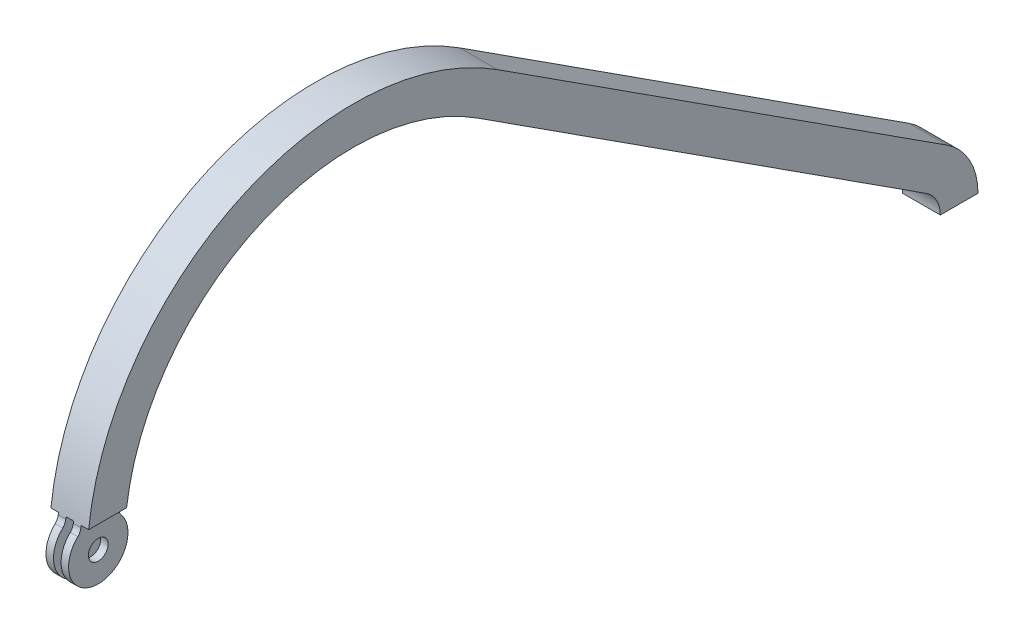
ISO-10303-21;
HEADER;
FILE_DESCRIPTION(('STEP AP214'),'2;1');
FILE_NAME('part.step','',(''),(''),'','','');
FILE_SCHEMA(('AUTOMOTIVE_DESIGN { 1 0 10303 214 1 1 1 1 }'));
ENDSEC;
DATA;
#1=APPLICATION_CONTEXT('core data for automotive mechanical design processes');
#2=APPLICATION_PROTOCOL_DEFINITION('international standard','automotive_design',2000,#1);
#3=PRODUCT_CONTEXT('',#1,'mechanical');
#4=PRODUCT('Part','Part','',(#3));
#5=PRODUCT_RELATED_PRODUCT_CATEGORY('part','',(#4));
#6=PRODUCT_DEFINITION_FORMATION('','',#4);
#7=PRODUCT_DEFINITION_CONTEXT('part definition',#1,'design');
#8=PRODUCT_DEFINITION('design','',#6,#7);
#9=PRODUCT_DEFINITION_SHAPE('','',#8);
#10=(LENGTH_UNIT() NAMED_UNIT(*) SI_UNIT(.MILLI.,.METRE.));
#11=(NAMED_UNIT(*) PLANE_ANGLE_UNIT() SI_UNIT($,.RADIAN.));
#12=(NAMED_UNIT(*) SI_UNIT($,.STERADIAN.) SOLID_ANGLE_UNIT());
#13=UNCERTAINTY_MEASURE_WITH_UNIT(LENGTH_MEASURE(1.E-05),#10,'distance_accuracy_value','');
#14=(GEOMETRIC_REPRESENTATION_CONTEXT(3) GLOBAL_UNCERTAINTY_ASSIGNED_CONTEXT((#13)) GLOBAL_UNIT_ASSIGNED_CONTEXT((#10,
#11,#12)) REPRESENTATION_CONTEXT('',''));
#15=CARTESIAN_POINT('',(0.,0.,0.));
#16=DIRECTION('',(0.,0.,1.));
#17=DIRECTION('',(1.,0.,0.));
#18=AXIS2_PLACEMENT_3D('',#15,#16,#17);
#19=CARTESIAN_POINT('',(-19.05,26.0043643236474,-829.283192071922));
#20=DIRECTION('',(1.,0.,0.));
#21=DIRECTION('',(0.,0.,-1.));
#22=AXIS2_PLACEMENT_3D('',#19,#20,#21);
#23=PLANE('',#22);
#24=DIRECTION('',(0.,0.,-1.));
#25=VECTOR('',#24,1.);
#26=CARTESIAN_POINT('',(-19.05,155.,-829.283192071922));
#27=LINE('',#26,#25);
#28=CARTESIAN_POINT('',(-19.05,155.,17.3722171430682));
#29=VERTEX_POINT('',#28);
#30=CARTESIAN_POINT('',(-19.05,155.,-21.0067632003076));
#31=VERTEX_POINT('',#30);
#32=EDGE_CURVE('E44',#29,#31,#27,.T.);
#33=ORIENTED_EDGE('',*,*,#32,.F.);
#34=CARTESIAN_POINT('',(-19.05,125.,-250.));
#35=DIRECTION('',(1.,0.,0.));
#36=DIRECTION('',(0.,0.,-1.));
#37=AXIS2_PLACEMENT_3D('',#34,#35,#36);
#38=CIRCLE('',#37,269.05);
#39=CARTESIAN_POINT('',(-19.05,351.05732540476,-395.89718342328));
#40=VERTEX_POINT('',#39);
#41=EDGE_CURVE('E191',#40,#29,#38,.T.);
#42=ORIENTED_EDGE('',*,*,#41,.F.);
#43=DIRECTION('',(0.,0.542267918317339,0.840205632428026));
#44=VECTOR('',#43,1.);
#45=CARTESIAN_POINT('',(-19.05,58.0161989191552,-849.943599759812));
#46=LINE('',#45,#44);
#47=CARTESIAN_POINT('',(-19.05,58.0161989191552,-849.943599759812));
#48=VERTEX_POINT('',#47);
#49=EDGE_CURVE('E333',#48,#40,#46,.T.);
#50=ORIENTED_EDGE('',*,*,#49,.F.);
#51=CARTESIAN_POINT('',(-19.05,0.,-812.5));
#52=DIRECTION('',(-1.,0.,0.));
#53=DIRECTION('',(0.,0.,1.));
#54=AXIS2_PLACEMENT_3D('',#51,#52,#53);
#55=CIRCLE('',#54,69.0500000000001);
#56=CARTESIAN_POINT('',(-19.05,0.,-881.55));
#57=VERTEX_POINT('',#56);
#58=EDGE_CURVE('E318',#48,#57,#55,.T.);
#59=ORIENTED_EDGE('',*,*,#58,.T.);
#60=DIRECTION('',(0.,0.,1.));
#61=VECTOR('',#60,1.);
#62=CARTESIAN_POINT('',(-19.05,0.,-843.45));
#63=LINE('',#62,#61);
#64=CARTESIAN_POINT('',(-19.05,0.,-843.45));
#65=VERTEX_POINT('',#64);
#66=EDGE_CURVE('E304',#57,#65,#63,.T.);
#67=ORIENTED_EDGE('',*,*,#66,.T.);
#68=CARTESIAN_POINT('',(-19.05,0.,-812.5));
#69=DIRECTION('',(-1.,0.,0.));
#70=DIRECTION('',(0.,0.,1.));
#71=AXIS2_PLACEMENT_3D('',#68,#69,#70);
#72=CIRCLE('',#71,30.95);
#73=CARTESIAN_POINT('',(-19.05,26.0043643236474,-829.283192071922));
#74=VERTEX_POINT('',#73);
#75=EDGE_CURVE('E320',#74,#65,#72,.T.);
#76=ORIENTED_EDGE('',*,*,#75,.F.);
#77=DIRECTION('',(0.,0.542267918317339,0.840205632428026));
#78=VECTOR('',#77,1.);
#79=CARTESIAN_POINT('',(-19.05,26.0043643236474,-829.283192071922));
#80=LINE('',#79,#78);
#81=CARTESIAN_POINT('',(-19.05,319.045490809253,-375.236775735389));
#82=VERTEX_POINT('',#81);
#83=EDGE_CURVE('E190',#74,#82,#80,.T.);
#84=ORIENTED_EDGE('',*,*,#83,.T.);
#85=CARTESIAN_POINT('',(-19.05,125.,-250.));
#86=DIRECTION('',(1.,0.,0.));
#87=DIRECTION('',(0.,0.,-1.));
#88=AXIS2_PLACEMENT_3D('',#85,#86,#87);
#89=CIRCLE('',#88,230.95);
#90=EDGE_CURVE('E182',#82,#31,#89,.T.);
#91=ORIENTED_EDGE('',*,*,#90,.T.);
#92=EDGE_LOOP('',(#33,#42,#50,#59,#67,#76,#84,#91));
#93=FACE_BOUND('',#92,.T.);
#94=ADVANCED_FACE('F36',(#93),#23,.F.);
#95=CARTESIAN_POINT('',(0.,125.,-250.));
#96=DIRECTION('',(1.,0.,0.));
#97=DIRECTION('',(0.,0.,-1.));
#98=AXIS2_PLACEMENT_3D('',#95,#96,#97);
#99=CYLINDRICAL_SURFACE('',#98,269.05);
#100=CARTESIAN_POINT('',(-11.43,125.,-250.));
#101=DIRECTION('',(1.,0.,0.));
#102=DIRECTION('',(0.,0.,-1.));
#103=AXIS2_PLACEMENT_3D('',#100,#101,#102);
#104=CIRCLE('',#103,269.05);
#105=CARTESIAN_POINT('',(-11.43,152.971883559192,17.5919958260168));
#106=VERTEX_POINT('',#105);
#107=CARTESIAN_POINT('',(-11.43,155.,17.3722171430682));
#108=VERTEX_POINT('',#107);
#109=EDGE_CURVE('E437',#106,#108,#104,.F.);
#110=ORIENTED_EDGE('',*,*,#109,.F.);
#111=DIRECTION('',(1.,0.,0.));
#112=VECTOR('',#111,1.);
#113=CARTESIAN_POINT('',(-102.481045081555,152.971883559192,17.5919958260169));
#114=LINE('',#113,#112);
#115=CARTESIAN_POINT('',(-3.81000000000001,152.971883559192,17.5919958260168));
#116=VERTEX_POINT('',#115);
#117=EDGE_CURVE('E287',#106,#116,#114,.T.);
#118=ORIENTED_EDGE('',*,*,#117,.T.);
#119=CARTESIAN_POINT('',(-3.81000000000001,125.,-250.));
#120=DIRECTION('',(1.,0.,0.));
#121=DIRECTION('',(0.,0.,-1.));
#122=AXIS2_PLACEMENT_3D('',#119,#120,#121);
#123=CIRCLE('',#122,269.05);
#124=CARTESIAN_POINT('',(-3.81000000000001,155.,17.3722171430682));
#125=VERTEX_POINT('',#124);
#126=EDGE_CURVE('E251',#116,#125,#123,.F.);
#127=ORIENTED_EDGE('',*,*,#126,.T.);
#128=DIRECTION('',(1.,0.,0.));
#129=VECTOR('',#128,1.);
#130=CARTESIAN_POINT('',(0.,155.,17.3722171430682));
#131=LINE('',#130,#129);
#132=CARTESIAN_POINT('',(3.80999999999999,155.,17.3722171430682));
#133=VERTEX_POINT('',#132);
#134=EDGE_CURVE('E257',#125,#133,#131,.T.);
#135=ORIENTED_EDGE('',*,*,#134,.T.);
#136=CARTESIAN_POINT('',(3.80999999999999,125.,-250.));
#137=DIRECTION('',(1.,0.,0.));
#138=DIRECTION('',(0.,0.,-1.));
#139=AXIS2_PLACEMENT_3D('',#136,#137,#138);
#140=CIRCLE('',#139,269.05);
#141=CARTESIAN_POINT('',(3.80999999999999,152.971883559192,17.5919958260168));
#142=VERTEX_POINT('',#141);
#143=EDGE_CURVE('E229',#142,#133,#140,.F.);
#144=ORIENTED_EDGE('',*,*,#143,.F.);
#145=CARTESIAN_POINT('',(11.43,152.971883559192,17.5919958260168));
#146=VERTEX_POINT('',#145);
#147=EDGE_CURVE('E290',#142,#146,#114,.T.);
#148=ORIENTED_EDGE('',*,*,#147,.T.);
#149=CARTESIAN_POINT('',(11.43,125.,-250.));
#150=DIRECTION('',(1.,0.,0.));
#151=DIRECTION('',(0.,0.,-1.));
#152=AXIS2_PLACEMENT_3D('',#149,#150,#151);
#153=CIRCLE('',#152,269.05);
#154=CARTESIAN_POINT('',(11.43,155.,17.3722171430682));
#155=VERTEX_POINT('',#154);
#156=EDGE_CURVE('E274',#146,#155,#153,.F.);
#157=ORIENTED_EDGE('',*,*,#156,.T.);
#158=DIRECTION('',(1.,0.,0.));
#159=VECTOR('',#158,1.);
#160=CARTESIAN_POINT('',(0.,155.,17.3722171430682));
#161=LINE('',#160,#159);
#162=CARTESIAN_POINT('',(19.05,155.,17.3722171430682));
#163=VERTEX_POINT('',#162);
#164=EDGE_CURVE('E283',#155,#163,#161,.T.);
#165=ORIENTED_EDGE('',*,*,#164,.T.);
#166=CARTESIAN_POINT('',(19.05,125.,-250.));
#167=DIRECTION('',(1.,0.,0.));
#168=DIRECTION('',(0.,0.,-1.));
#169=AXIS2_PLACEMENT_3D('',#166,#167,#168);
#170=CIRCLE('',#169,269.05);
#171=CARTESIAN_POINT('',(19.05,351.05732540476,-395.89718342328));
#172=VERTEX_POINT('',#171);
#173=EDGE_CURVE('E194',#172,#163,#170,.T.);
#174=ORIENTED_EDGE('',*,*,#173,.F.);
#175=DIRECTION('',(-1.,0.,0.));
#176=VECTOR('',#175,1.);
#177=CARTESIAN_POINT('',(-19.05,351.05732540476,-395.89718342328));
#178=LINE('',#177,#176);
#179=EDGE_CURVE('E326',#172,#40,#178,.T.);
#180=ORIENTED_EDGE('',*,*,#179,.T.);
#181=ORIENTED_EDGE('',*,*,#41,.T.);
#182=DIRECTION('',(1.,0.,0.));
#183=VECTOR('',#182,1.);
#184=CARTESIAN_POINT('',(0.,155.,17.3722171430682));
#185=LINE('',#184,#183);
#186=EDGE_CURVE('E51',#29,#108,#185,.T.);
#187=ORIENTED_EDGE('',*,*,#186,.T.);
#188=EDGE_LOOP('',(#110,#118,#127,#135,#144,#148,#157,#165,#174,#180,#181,#187));
#189=FACE_BOUND('',#188,.T.);
#190=ADVANCED_FACE('F38',(#189),#99,.T.);
#191=CARTESIAN_POINT('',(0.,125.,-250.));
#192=DIRECTION('',(1.,0.,0.));
#193=DIRECTION('',(0.,0.,-1.));
#194=AXIS2_PLACEMENT_3D('',#191,#192,#193);
#195=CYLINDRICAL_SURFACE('',#194,230.95);
#196=CARTESIAN_POINT('',(-11.43,125.,-250.));
#197=DIRECTION('',(1.,0.,0.));
#198=DIRECTION('',(0.,0.,-1.));
#199=AXIS2_PLACEMENT_3D('',#196,#197,#198);
#200=CIRCLE('',#199,230.95);
#201=CARTESIAN_POINT('',(-11.43,155.,-21.0067632003076));
#202=VERTEX_POINT('',#201);
#203=CARTESIAN_POINT('',(-11.43,151.97400922289,-20.6306355974202));
#204=VERTEX_POINT('',#203);
#205=EDGE_CURVE('E185',#202,#204,#200,.T.);
#206=ORIENTED_EDGE('',*,*,#205,.F.);
#207=DIRECTION('',(1.,0.,0.));
#208=VECTOR('',#207,1.);
#209=CARTESIAN_POINT('',(0.,155.,-21.0067632003076));
#210=LINE('',#209,#208);
#211=EDGE_CURVE('E172',#202,#31,#210,.F.);
#212=ORIENTED_EDGE('',*,*,#211,.T.);
#213=ORIENTED_EDGE('',*,*,#90,.F.);
#214=DIRECTION('',(1.,0.,0.));
#215=VECTOR('',#214,1.);
#216=CARTESIAN_POINT('',(-19.05,319.045490809253,-375.236775735389));
#217=LINE('',#216,#215);
#218=CARTESIAN_POINT('',(19.05,319.045490809253,-375.236775735389));
#219=VERTEX_POINT('',#218);
#220=EDGE_CURVE('E324',#82,#219,#217,.T.);
#221=ORIENTED_EDGE('',*,*,#220,.T.);
#222=CARTESIAN_POINT('',(19.05,125.,-250.));
#223=DIRECTION('',(1.,0.,0.));
#224=DIRECTION('',(0.,0.,-1.));
#225=AXIS2_PLACEMENT_3D('',#222,#223,#224);
#226=CIRCLE('',#225,230.95);
#227=CARTESIAN_POINT('',(19.05,155.,-21.0067632003076));
#228=VERTEX_POINT('',#227);
#229=EDGE_CURVE('E192',#219,#228,#226,.T.);
#230=ORIENTED_EDGE('',*,*,#229,.T.);
#231=DIRECTION('',(1.,0.,0.));
#232=VECTOR('',#231,1.);
#233=CARTESIAN_POINT('',(0.,155.,-21.0067632003076));
#234=LINE('',#233,#232);
#235=CARTESIAN_POINT('',(11.43,155.,-21.0067632003076));
#236=VERTEX_POINT('',#235);
#237=EDGE_CURVE('E280',#228,#236,#234,.F.);
#238=ORIENTED_EDGE('',*,*,#237,.T.);
#239=CARTESIAN_POINT('',(11.43,125.,-250.));
#240=DIRECTION('',(1.,0.,0.));
#241=DIRECTION('',(0.,0.,-1.));
#242=AXIS2_PLACEMENT_3D('',#239,#240,#241);
#243=CIRCLE('',#242,230.95);
#244=CARTESIAN_POINT('',(11.43,151.97400922289,-20.6306355974202));
#245=VERTEX_POINT('',#244);
#246=EDGE_CURVE('E271',#236,#245,#243,.T.);
#247=ORIENTED_EDGE('',*,*,#246,.T.);
#248=DIRECTION('',(1.,0.,0.));
#249=VECTOR('',#248,1.);
#250=CARTESIAN_POINT('',(-102.481045081555,151.97400922289,-20.6306355974202));
#251=LINE('',#250,#249);
#252=CARTESIAN_POINT('',(3.80999999999999,151.97400922289,-20.6306355974202));
#253=VERTEX_POINT('',#252);
#254=EDGE_CURVE('E293',#253,#245,#251,.T.);
#255=ORIENTED_EDGE('',*,*,#254,.F.);
#256=CARTESIAN_POINT('',(3.80999999999999,125.,-250.));
#257=DIRECTION('',(1.,0.,0.));
#258=DIRECTION('',(0.,0.,-1.));
#259=AXIS2_PLACEMENT_3D('',#256,#257,#258);
#260=CIRCLE('',#259,230.95);
#261=CARTESIAN_POINT('',(3.80999999999999,155.,-21.0067632003076));
#262=VERTEX_POINT('',#261);
#263=EDGE_CURVE('E216',#262,#253,#260,.T.);
#264=ORIENTED_EDGE('',*,*,#263,.F.);
#265=DIRECTION('',(1.,0.,0.));
#266=VECTOR('',#265,1.);
#267=CARTESIAN_POINT('',(0.,155.,-21.0067632003076));
#268=LINE('',#267,#266);
#269=CARTESIAN_POINT('',(-3.81000000000001,155.,-21.0067632003076));
#270=VERTEX_POINT('',#269);
#271=EDGE_CURVE('E177',#262,#270,#268,.F.);
#272=ORIENTED_EDGE('',*,*,#271,.T.);
#273=CARTESIAN_POINT('',(-3.81000000000001,125.,-250.));
#274=DIRECTION('',(1.,0.,0.));
#275=DIRECTION('',(0.,0.,-1.));
#276=AXIS2_PLACEMENT_3D('',#273,#274,#275);
#277=CIRCLE('',#276,230.95);
#278=CARTESIAN_POINT('',(-3.81000000000001,151.97400922289,-20.6306355974202));
#279=VERTEX_POINT('',#278);
#280=EDGE_CURVE('E214',#270,#279,#277,.T.);
#281=ORIENTED_EDGE('',*,*,#280,.T.);
#282=EDGE_CURVE('E291',#204,#279,#251,.T.);
#283=ORIENTED_EDGE('',*,*,#282,.F.);
#284=EDGE_LOOP('',(#206,#212,#213,#221,#230,#238,#247,#255,#264,#272,#281,#283));
#285=FACE_BOUND('',#284,.T.);
#286=ADVANCED_FACE('F180',(#285),#195,.F.);
#287=CARTESIAN_POINT('',(-102.481045081555,154.011537287465,27.537805));
#288=DIRECTION('',(1.,0.,0.));
#289=DIRECTION('',(0.,0.,-1.));
#290=AXIS2_PLACEMENT_3D('',#287,#288,#289);
#291=CYLINDRICAL_SURFACE('',#290,10.);
#292=ORIENTED_EDGE('',*,*,#117,.F.);
#293=CARTESIAN_POINT('',(-11.43,154.011537287465,27.537805));
#294=DIRECTION('',(1.,0.,0.));
#295=DIRECTION('',(0.,0.,-1.));
#296=AXIS2_PLACEMENT_3D('',#293,#294,#295);
#297=CIRCLE('',#296,10.);
#298=CARTESIAN_POINT('',(-11.43,146.758652965599,20.65335375));
#299=VERTEX_POINT('',#298);
#300=EDGE_CURVE('E430',#106,#299,#297,.F.);
#301=ORIENTED_EDGE('',*,*,#300,.T.);
#302=DIRECTION('',(1.,0.,0.));
#303=VECTOR('',#302,1.);
#304=CARTESIAN_POINT('',(-102.481045081555,146.758652965599,20.65335375));
#305=LINE('',#304,#303);
#306=CARTESIAN_POINT('',(-3.81000000000001,146.758652965599,20.65335375));
#307=VERTEX_POINT('',#306);
#308=EDGE_CURVE('E297',#299,#307,#305,.T.);
#309=ORIENTED_EDGE('',*,*,#308,.T.);
#310=CARTESIAN_POINT('',(-3.81000000000001,154.011537287465,27.537805));
#311=DIRECTION('',(1.,0.,0.));
#312=DIRECTION('',(0.,0.,-1.));
#313=AXIS2_PLACEMENT_3D('',#310,#311,#312);
#314=CIRCLE('',#313,10.);
#315=EDGE_CURVE('E247',#116,#307,#314,.F.);
#316=ORIENTED_EDGE('',*,*,#315,.F.);
#317=EDGE_LOOP('',(#292,#301,#309,#316));
#318=FACE_BOUND('',#317,.T.);
#319=ADVANCED_FACE('F390',(#318),#291,.F.);
#320=CARTESIAN_POINT('',(-102.481045081555,125.,0.));
#321=DIRECTION('',(1.,0.,0.));
#322=DIRECTION('',(0.,0.,-1.));
#323=AXIS2_PLACEMENT_3D('',#320,#321,#322);
#324=CYLINDRICAL_SURFACE('',#323,10.);
#325=CARTESIAN_POINT('',(-11.43,125.,0.));
#326=DIRECTION('',(1.,0.,0.));
#327=DIRECTION('',(0.,0.,-1.));
#328=AXIS2_PLACEMENT_3D('',#325,#326,#327);
#329=CIRCLE('',#328,10.);
#330=CARTESIAN_POINT('',(-11.43,125.,-10.));
#331=VERTEX_POINT('',#330);
#332=EDGE_CURVE('E233',#331,#331,#329,.F.);
#333=ORIENTED_EDGE('',*,*,#332,.T.);
#334=EDGE_LOOP('',(#333));
#335=FACE_BOUND('',#334,.T.);
#336=CARTESIAN_POINT('',(-3.81000000000001,125.,0.));
#337=DIRECTION('',(1.,0.,0.));
#338=DIRECTION('',(0.,0.,-1.));
#339=AXIS2_PLACEMENT_3D('',#336,#337,#338);
#340=CIRCLE('',#339,10.);
#341=CARTESIAN_POINT('',(-3.81000000000001,125.,-10.));
#342=VERTEX_POINT('',#341);
#343=EDGE_CURVE('E254',#342,#342,#340,.F.);
#344=ORIENTED_EDGE('',*,*,#343,.F.);
#345=EDGE_LOOP('',(#344));
#346=FACE_BOUND('',#345,.T.);
#347=ADVANCED_FACE('F394',(#335,#346),#324,.F.);
#348=CARTESIAN_POINT('',(-102.481045081555,150.806050390983,-30.562195));
#349=DIRECTION('',(1.,0.,0.));
#350=DIRECTION('',(0.,0.,-1.));
#351=AXIS2_PLACEMENT_3D('',#348,#349,#350);
#352=CYLINDRICAL_SURFACE('',#351,9.99999999999999);
#353=DIRECTION('',(1.,0.,0.));
#354=VECTOR('',#353,1.);
#355=CARTESIAN_POINT('',(-102.481045081555,144.354537793238,-22.92164625));
#356=LINE('',#355,#354);
#357=CARTESIAN_POINT('',(-11.43,144.354537793238,-22.92164625));
#358=VERTEX_POINT('',#357);
#359=CARTESIAN_POINT('',(-3.81000000000001,144.354537793238,-22.92164625));
#360=VERTEX_POINT('',#359);
#361=EDGE_CURVE('E294',#358,#360,#356,.T.);
#362=ORIENTED_EDGE('',*,*,#361,.F.);
#363=CARTESIAN_POINT('',(-11.43,150.806050390983,-30.562195));
#364=DIRECTION('',(1.,0.,0.));
#365=DIRECTION('',(0.,0.,-1.));
#366=AXIS2_PLACEMENT_3D('',#363,#364,#365);
#367=CIRCLE('',#366,9.99999999999999);
#368=EDGE_CURVE('E427',#358,#204,#367,.F.);
#369=ORIENTED_EDGE('',*,*,#368,.T.);
#370=ORIENTED_EDGE('',*,*,#282,.T.);
#371=CARTESIAN_POINT('',(-3.81000000000001,150.806050390983,-30.562195));
#372=DIRECTION('',(1.,0.,0.));
#373=DIRECTION('',(0.,0.,-1.));
#374=AXIS2_PLACEMENT_3D('',#371,#372,#373);
#375=CIRCLE('',#374,9.99999999999999);
#376=EDGE_CURVE('E244',#360,#279,#375,.F.);
#377=ORIENTED_EDGE('',*,*,#376,.F.);
#378=EDGE_LOOP('',(#362,#369,#370,#377));
#379=FACE_BOUND('',#378,.T.);
#380=ADVANCED_FACE('F401',(#379),#352,.F.);
#381=CARTESIAN_POINT('',(-102.481045081555,125.,0.));
#382=DIRECTION('',(1.,0.,0.));
#383=DIRECTION('',(0.,0.,-1.));
#384=AXIS2_PLACEMENT_3D('',#381,#382,#383);
#385=CYLINDRICAL_SURFACE('',#384,30.);
#386=ORIENTED_EDGE('',*,*,#308,.F.);
#387=CARTESIAN_POINT('',(-11.43,125.,0.));
#388=DIRECTION('',(1.,0.,0.));
#389=DIRECTION('',(0.,0.,-1.));
#390=AXIS2_PLACEMENT_3D('',#387,#388,#389);
#391=CIRCLE('',#390,30.);
#392=EDGE_CURVE('E11',#358,#299,#391,.F.);
#393=ORIENTED_EDGE('',*,*,#392,.F.);
#394=ORIENTED_EDGE('',*,*,#361,.T.);
#395=CARTESIAN_POINT('',(-3.81000000000001,125.,0.));
#396=DIRECTION('',(1.,0.,0.));
#397=DIRECTION('',(0.,0.,-1.));
#398=AXIS2_PLACEMENT_3D('',#395,#396,#397);
#399=CIRCLE('',#398,30.);
#400=EDGE_CURVE('E208',#360,#307,#399,.F.);
#401=ORIENTED_EDGE('',*,*,#400,.T.);
#402=EDGE_LOOP('',(#386,#393,#394,#401));
#403=FACE_BOUND('',#402,.T.);
#404=ADVANCED_FACE('F462',(#403),#385,.T.);
#405=CARTESIAN_POINT('',(3.80999999999999,146.758652965599,20.65335375));
#406=VERTEX_POINT('',#405);
#407=CARTESIAN_POINT('',(11.43,146.758652965599,20.65335375));
#408=VERTEX_POINT('',#407);
#409=EDGE_CURVE('E286',#406,#408,#305,.T.);
#410=ORIENTED_EDGE('',*,*,#409,.F.);
#411=CARTESIAN_POINT('',(3.80999999999999,125.,0.));
#412=DIRECTION('',(1.,0.,0.));
#413=DIRECTION('',(0.,0.,-1.));
#414=AXIS2_PLACEMENT_3D('',#411,#412,#413);
#415=CIRCLE('',#414,30.);
#416=CARTESIAN_POINT('',(3.80999999999999,144.354537793238,-22.92164625));
#417=VERTEX_POINT('',#416);
#418=EDGE_CURVE('E206',#417,#406,#415,.F.);
#419=ORIENTED_EDGE('',*,*,#418,.F.);
#420=CARTESIAN_POINT('',(11.43,144.354537793238,-22.92164625));
#421=VERTEX_POINT('',#420);
#422=EDGE_CURVE('E296',#417,#421,#356,.T.);
#423=ORIENTED_EDGE('',*,*,#422,.T.);
#424=CARTESIAN_POINT('',(11.43,125.,0.));
#425=DIRECTION('',(1.,0.,0.));
#426=DIRECTION('',(0.,0.,-1.));
#427=AXIS2_PLACEMENT_3D('',#424,#425,#426);
#428=CIRCLE('',#427,30.);
#429=EDGE_CURVE('E203',#421,#408,#428,.F.);
#430=ORIENTED_EDGE('',*,*,#429,.T.);
#431=EDGE_LOOP('',(#410,#419,#423,#430));
#432=FACE_BOUND('',#431,.T.);
#433=ADVANCED_FACE('F414',(#432),#385,.T.);
#434=CARTESIAN_POINT('',(19.05,26.0043643236474,-829.283192071922));
#435=DIRECTION('',(-1.,0.,0.));
#436=DIRECTION('',(0.,0.,1.));
#437=AXIS2_PLACEMENT_3D('',#434,#435,#436);
#438=PLANE('',#437);
#439=DIRECTION('',(0.,0.,-1.));
#440=VECTOR('',#439,1.);
#441=CARTESIAN_POINT('',(19.05,155.,0.));
#442=LINE('',#441,#440);
#443=EDGE_CURVE('E262',#163,#228,#442,.T.);
#444=ORIENTED_EDGE('',*,*,#443,.T.);
#445=ORIENTED_EDGE('',*,*,#229,.F.);
#446=DIRECTION('',(0.,0.542267918317339,0.840205632428026));
#447=VECTOR('',#446,1.);
#448=CARTESIAN_POINT('',(19.05,26.0043643236474,-829.283192071922));
#449=LINE('',#448,#447);
#450=CARTESIAN_POINT('',(19.05,26.0043643236474,-829.283192071922));
#451=VERTEX_POINT('',#450);
#452=EDGE_CURVE('E329',#451,#219,#449,.T.);
#453=ORIENTED_EDGE('',*,*,#452,.F.);
#454=CARTESIAN_POINT('',(19.05,0.,-812.5));
#455=DIRECTION('',(-1.,0.,0.));
#456=DIRECTION('',(0.,0.,1.));
#457=AXIS2_PLACEMENT_3D('',#454,#455,#456);
#458=CIRCLE('',#457,30.95);
#459=CARTESIAN_POINT('',(19.05,0.,-843.45));
#460=VERTEX_POINT('',#459);
#461=EDGE_CURVE('E322',#451,#460,#458,.T.);
#462=ORIENTED_EDGE('',*,*,#461,.T.);
#463=DIRECTION('',(0.,0.,-1.));
#464=VECTOR('',#463,1.);
#465=CARTESIAN_POINT('',(19.05,0.,-843.45));
#466=LINE('',#465,#464);
#467=CARTESIAN_POINT('',(19.05,0.,-881.55));
#468=VERTEX_POINT('',#467);
#469=EDGE_CURVE('E289',#460,#468,#466,.T.);
#470=ORIENTED_EDGE('',*,*,#469,.T.);
#471=CARTESIAN_POINT('',(19.05,0.,-812.5));
#472=DIRECTION('',(-1.,0.,0.));
#473=DIRECTION('',(0.,0.,1.));
#474=AXIS2_PLACEMENT_3D('',#471,#472,#473);
#475=CIRCLE('',#474,69.0500000000001);
#476=CARTESIAN_POINT('',(19.05,58.0161989191552,-849.943599759812));
#477=VERTEX_POINT('',#476);
#478=EDGE_CURVE('E316',#477,#468,#475,.T.);
#479=ORIENTED_EDGE('',*,*,#478,.F.);
#480=DIRECTION('',(0.,0.542267918317339,0.840205632428026));
#481=VECTOR('',#480,1.);
#482=CARTESIAN_POINT('',(19.05,58.0161989191552,-849.943599759812));
#483=LINE('',#482,#481);
#484=EDGE_CURVE('E197',#477,#172,#483,.T.);
#485=ORIENTED_EDGE('',*,*,#484,.T.);
#486=ORIENTED_EDGE('',*,*,#173,.T.);
#487=EDGE_LOOP('',(#444,#445,#453,#462,#470,#479,#485,#486));
#488=FACE_BOUND('',#487,.T.);
#489=ADVANCED_FACE('F338',(#488),#438,.F.);
#490=ORIENTED_EDGE('',*,*,#147,.F.);
#491=CARTESIAN_POINT('',(3.80999999999999,154.011537287465,27.537805));
#492=DIRECTION('',(1.,0.,0.));
#493=DIRECTION('',(0.,0.,-1.));
#494=AXIS2_PLACEMENT_3D('',#491,#492,#493);
#495=CIRCLE('',#494,10.);
#496=EDGE_CURVE('E231',#142,#406,#495,.F.);
#497=ORIENTED_EDGE('',*,*,#496,.T.);
#498=ORIENTED_EDGE('',*,*,#409,.T.);
#499=CARTESIAN_POINT('',(11.43,154.011537287465,27.537805));
#500=DIRECTION('',(1.,0.,0.));
#501=DIRECTION('',(0.,0.,-1.));
#502=AXIS2_PLACEMENT_3D('',#499,#500,#501);
#503=CIRCLE('',#502,10.);
#504=EDGE_CURVE('E268',#146,#408,#503,.F.);
#505=ORIENTED_EDGE('',*,*,#504,.F.);
#506=EDGE_LOOP('',(#490,#497,#498,#505));
#507=FACE_BOUND('',#506,.T.);
#508=ADVANCED_FACE('F397',(#507),#291,.F.);
#509=CARTESIAN_POINT('',(3.80999999999999,125.,0.));
#510=DIRECTION('',(1.,0.,0.));
#511=DIRECTION('',(0.,0.,-1.));
#512=AXIS2_PLACEMENT_3D('',#509,#510,#511);
#513=CIRCLE('',#512,10.);
#514=CARTESIAN_POINT('',(3.80999999999999,125.,-10.));
#515=VERTEX_POINT('',#514);
#516=EDGE_CURVE('E241',#515,#515,#513,.F.);
#517=ORIENTED_EDGE('',*,*,#516,.T.);
#518=EDGE_LOOP('',(#517));
#519=FACE_BOUND('',#518,.T.);
#520=CARTESIAN_POINT('',(11.43,125.,0.));
#521=DIRECTION('',(1.,0.,0.));
#522=DIRECTION('',(0.,0.,-1.));
#523=AXIS2_PLACEMENT_3D('',#520,#521,#522);
#524=CIRCLE('',#523,10.);
#525=CARTESIAN_POINT('',(11.43,125.,-10.));
#526=VERTEX_POINT('',#525);
#527=EDGE_CURVE('E277',#526,#526,#524,.F.);
#528=ORIENTED_EDGE('',*,*,#527,.F.);
#529=EDGE_LOOP('',(#528));
#530=FACE_BOUND('',#529,.T.);
#531=ADVANCED_FACE('F404',(#519,#530),#324,.F.);
#532=ORIENTED_EDGE('',*,*,#422,.F.);
#533=CARTESIAN_POINT('',(3.80999999999999,150.806050390983,-30.562195));
#534=DIRECTION('',(1.,0.,0.));
#535=DIRECTION('',(0.,0.,-1.));
#536=AXIS2_PLACEMENT_3D('',#533,#534,#535);
#537=CIRCLE('',#536,9.99999999999999);
#538=EDGE_CURVE('E59',#417,#253,#537,.F.);
#539=ORIENTED_EDGE('',*,*,#538,.T.);
#540=ORIENTED_EDGE('',*,*,#254,.T.);
#541=CARTESIAN_POINT('',(11.43,150.806050390983,-30.562195));
#542=DIRECTION('',(1.,0.,0.));
#543=DIRECTION('',(0.,0.,-1.));
#544=AXIS2_PLACEMENT_3D('',#541,#542,#543);
#545=CIRCLE('',#544,9.99999999999999);
#546=EDGE_CURVE('E265',#421,#245,#545,.F.);
#547=ORIENTED_EDGE('',*,*,#546,.F.);
#548=EDGE_LOOP('',(#532,#539,#540,#547));
#549=FACE_BOUND('',#548,.T.);
#550=ADVANCED_FACE('F388',(#549),#352,.F.);
#551=CARTESIAN_POINT('',(-19.05,58.0161989191552,-849.943599759812));
#552=DIRECTION('',(0.,0.840205632428026,-0.542267918317339));
#553=DIRECTION('',(0.,0.542267918317339,0.840205632428026));
#554=AXIS2_PLACEMENT_3D('',#551,#552,#553);
#555=PLANE('',#554);
#556=DIRECTION('',(-1.,0.,0.));
#557=VECTOR('',#556,1.);
#558=CARTESIAN_POINT('',(-19.05,58.0161989191552,-849.943599759812));
#559=LINE('',#558,#557);
#560=EDGE_CURVE('E310',#477,#48,#559,.T.);
#561=ORIENTED_EDGE('',*,*,#560,.T.);
#562=ORIENTED_EDGE('',*,*,#49,.T.);
#563=ORIENTED_EDGE('',*,*,#179,.F.);
#564=ORIENTED_EDGE('',*,*,#484,.F.);
#565=EDGE_LOOP('',(#561,#562,#563,#564));
#566=FACE_BOUND('',#565,.T.);
#567=ADVANCED_FACE('F342',(#566),#555,.T.);
#568=CARTESIAN_POINT('',(-19.05,26.0043643236474,-829.283192071922));
#569=DIRECTION('',(0.,-0.840205632428026,0.542267918317339));
#570=DIRECTION('',(0.,-0.542267918317339,-0.840205632428026));
#571=AXIS2_PLACEMENT_3D('',#568,#569,#570);
#572=PLANE('',#571);
#573=DIRECTION('',(1.,0.,0.));
#574=VECTOR('',#573,1.);
#575=CARTESIAN_POINT('',(-19.05,26.0043643236474,-829.283192071922));
#576=LINE('',#575,#574);
#577=EDGE_CURVE('E313',#74,#451,#576,.T.);
#578=ORIENTED_EDGE('',*,*,#577,.T.);
#579=ORIENTED_EDGE('',*,*,#452,.T.);
#580=ORIENTED_EDGE('',*,*,#220,.F.);
#581=ORIENTED_EDGE('',*,*,#83,.F.);
#582=EDGE_LOOP('',(#578,#579,#580,#581));
#583=FACE_BOUND('',#582,.T.);
#584=ADVANCED_FACE('F357',(#583),#572,.T.);
#585=CARTESIAN_POINT('',(0.,0.,-812.5));
#586=DIRECTION('',(-1.,0.,0.));
#587=DIRECTION('',(0.,0.,1.));
#588=AXIS2_PLACEMENT_3D('',#585,#586,#587);
#589=CYLINDRICAL_SURFACE('',#588,30.95);
#590=ORIENTED_EDGE('',*,*,#75,.T.);
#591=DIRECTION('',(1.,0.,0.));
#592=VECTOR('',#591,1.);
#593=CARTESIAN_POINT('',(-19.05,0.,-843.45));
#594=LINE('',#593,#592);
#595=EDGE_CURVE('E307',#65,#460,#594,.T.);
#596=ORIENTED_EDGE('',*,*,#595,.T.);
#597=ORIENTED_EDGE('',*,*,#461,.F.);
#598=ORIENTED_EDGE('',*,*,#577,.F.);
#599=EDGE_LOOP('',(#590,#596,#597,#598));
#600=FACE_BOUND('',#599,.T.);
#601=ADVANCED_FACE('F361',(#600),#589,.F.);
#602=CARTESIAN_POINT('',(0.,0.,-812.5));
#603=DIRECTION('',(-1.,0.,0.));
#604=DIRECTION('',(0.,0.,1.));
#605=AXIS2_PLACEMENT_3D('',#602,#603,#604);
#606=CYLINDRICAL_SURFACE('',#605,69.0500000000001);
#607=ORIENTED_EDGE('',*,*,#560,.F.);
#608=ORIENTED_EDGE('',*,*,#478,.T.);
#609=DIRECTION('',(-1.,0.,0.));
#610=VECTOR('',#609,1.);
#611=CARTESIAN_POINT('',(-19.05,0.,-881.55));
#612=LINE('',#611,#610);
#613=EDGE_CURVE('E301',#468,#57,#612,.T.);
#614=ORIENTED_EDGE('',*,*,#613,.T.);
#615=ORIENTED_EDGE('',*,*,#58,.F.);
#616=EDGE_LOOP('',(#607,#608,#614,#615));
#617=FACE_BOUND('',#616,.T.);
#618=ADVANCED_FACE('F369',(#617),#606,.T.);
#619=CARTESIAN_POINT('',(0.,0.,0.));
#620=DIRECTION('',(0.,-1.,0.));
#621=DIRECTION('',(0.,0.,-1.));
#622=AXIS2_PLACEMENT_3D('',#619,#620,#621);
#623=PLANE('',#622);
#624=ORIENTED_EDGE('',*,*,#469,.F.);
#625=ORIENTED_EDGE('',*,*,#595,.F.);
#626=ORIENTED_EDGE('',*,*,#66,.F.);
#627=ORIENTED_EDGE('',*,*,#613,.F.);
#628=EDGE_LOOP('',(#624,#625,#626,#627));
#629=FACE_BOUND('',#628,.T.);
#630=ADVANCED_FACE('F366',(#629),#623,.T.);
#631=CARTESIAN_POINT('',(11.43,155.,0.));
#632=DIRECTION('',(1.,0.,0.));
#633=DIRECTION('',(0.,0.,-1.));
#634=AXIS2_PLACEMENT_3D('',#631,#632,#633);
#635=PLANE('',#634);
#636=ORIENTED_EDGE('',*,*,#504,.T.);
#637=ORIENTED_EDGE('',*,*,#429,.F.);
#638=ORIENTED_EDGE('',*,*,#546,.T.);
#639=ORIENTED_EDGE('',*,*,#246,.F.);
#640=DIRECTION('',(0.,0.,1.));
#641=VECTOR('',#640,1.);
#642=CARTESIAN_POINT('',(11.43,155.,0.));
#643=LINE('',#642,#641);
#644=EDGE_CURVE('E259',#236,#155,#643,.T.);
#645=ORIENTED_EDGE('',*,*,#644,.T.);
#646=ORIENTED_EDGE('',*,*,#156,.F.);
#647=EDGE_LOOP('',(#636,#637,#638,#639,#645,#646));
#648=FACE_BOUND('',#647,.T.);
#649=ORIENTED_EDGE('',*,*,#527,.T.);
#650=EDGE_LOOP('',(#649));
#651=FACE_BOUND('',#650,.T.);
#652=ADVANCED_FACE('F351',(#648,#651),#635,.T.);
#653=CARTESIAN_POINT('',(0.,155.,0.));
#654=DIRECTION('',(0.,-1.,0.));
#655=DIRECTION('',(0.,0.,-1.));
#656=AXIS2_PLACEMENT_3D('',#653,#654,#655);
#657=PLANE('',#656);
#658=ORIENTED_EDGE('',*,*,#644,.F.);
#659=ORIENTED_EDGE('',*,*,#237,.F.);
#660=ORIENTED_EDGE('',*,*,#443,.F.);
#661=ORIENTED_EDGE('',*,*,#164,.F.);
#662=EDGE_LOOP('',(#658,#659,#660,#661));
#663=FACE_BOUND('',#662,.T.);
#664=ADVANCED_FACE('F349',(#663),#657,.T.);
#665=CARTESIAN_POINT('',(-3.81000000000001,155.,0.));
#666=DIRECTION('',(1.,0.,0.));
#667=DIRECTION('',(0.,0.,-1.));
#668=AXIS2_PLACEMENT_3D('',#665,#666,#667);
#669=PLANE('',#668);
#670=ORIENTED_EDGE('',*,*,#315,.T.);
#671=ORIENTED_EDGE('',*,*,#400,.F.);
#672=ORIENTED_EDGE('',*,*,#376,.T.);
#673=ORIENTED_EDGE('',*,*,#280,.F.);
#674=DIRECTION('',(0.,0.,1.));
#675=VECTOR('',#674,1.);
#676=CARTESIAN_POINT('',(-3.81000000000001,155.,0.));
#677=LINE('',#676,#675);
#678=EDGE_CURVE('E225',#270,#125,#677,.T.);
#679=ORIENTED_EDGE('',*,*,#678,.T.);
#680=ORIENTED_EDGE('',*,*,#126,.F.);
#681=EDGE_LOOP('',(#670,#671,#672,#673,#679,#680));
#682=FACE_BOUND('',#681,.T.);
#683=ORIENTED_EDGE('',*,*,#343,.T.);
#684=EDGE_LOOP('',(#683));
#685=FACE_BOUND('',#684,.T.);
#686=ADVANCED_FACE('F419',(#682,#685),#669,.T.);
#687=CARTESIAN_POINT('',(3.80999999999999,155.,0.));
#688=DIRECTION('',(1.,0.,0.));
#689=DIRECTION('',(0.,0.,-1.));
#690=AXIS2_PLACEMENT_3D('',#687,#688,#689);
#691=PLANE('',#690);
#692=ORIENTED_EDGE('',*,*,#143,.T.);
#693=DIRECTION('',(0.,0.,1.));
#694=VECTOR('',#693,1.);
#695=CARTESIAN_POINT('',(3.80999999999999,155.,0.));
#696=LINE('',#695,#694);
#697=EDGE_CURVE('E222',#262,#133,#696,.T.);
#698=ORIENTED_EDGE('',*,*,#697,.F.);
#699=ORIENTED_EDGE('',*,*,#263,.T.);
#700=ORIENTED_EDGE('',*,*,#538,.F.);
#701=ORIENTED_EDGE('',*,*,#418,.T.);
#702=ORIENTED_EDGE('',*,*,#496,.F.);
#703=EDGE_LOOP('',(#692,#698,#699,#700,#701,#702));
#704=FACE_BOUND('',#703,.T.);
#705=ORIENTED_EDGE('',*,*,#516,.F.);
#706=EDGE_LOOP('',(#705));
#707=FACE_BOUND('',#706,.T.);
#708=ADVANCED_FACE('F226',(#704,#707),#691,.F.);
#709=CARTESIAN_POINT('',(0.,155.,0.));
#710=DIRECTION('',(0.,-1.,0.));
#711=DIRECTION('',(0.,0.,-1.));
#712=AXIS2_PLACEMENT_3D('',#709,#710,#711);
#713=PLANE('',#712);
#714=ORIENTED_EDGE('',*,*,#678,.F.);
#715=ORIENTED_EDGE('',*,*,#271,.F.);
#716=ORIENTED_EDGE('',*,*,#697,.T.);
#717=ORIENTED_EDGE('',*,*,#134,.F.);
#718=EDGE_LOOP('',(#714,#715,#716,#717));
#719=FACE_BOUND('',#718,.T.);
#720=ADVANCED_FACE('F221',(#719),#713,.T.);
#721=CARTESIAN_POINT('',(-11.43,155.,0.));
#722=DIRECTION('',(1.,0.,0.));
#723=DIRECTION('',(0.,0.,-1.));
#724=AXIS2_PLACEMENT_3D('',#721,#722,#723);
#725=PLANE('',#724);
#726=ORIENTED_EDGE('',*,*,#109,.T.);
#727=DIRECTION('',(0.,0.,1.));
#728=VECTOR('',#727,1.);
#729=CARTESIAN_POINT('',(-11.43,155.,0.));
#730=LINE('',#729,#728);
#731=EDGE_CURVE('E186',#202,#108,#730,.T.);
#732=ORIENTED_EDGE('',*,*,#731,.F.);
#733=ORIENTED_EDGE('',*,*,#205,.T.);
#734=ORIENTED_EDGE('',*,*,#368,.F.);
#735=ORIENTED_EDGE('',*,*,#392,.T.);
#736=ORIENTED_EDGE('',*,*,#300,.F.);
#737=EDGE_LOOP('',(#726,#732,#733,#734,#735,#736));
#738=FACE_BOUND('',#737,.T.);
#739=ORIENTED_EDGE('',*,*,#332,.F.);
#740=EDGE_LOOP('',(#739));
#741=FACE_BOUND('',#740,.T.);
#742=ADVANCED_FACE('F442',(#738,#741),#725,.F.);
#743=CARTESIAN_POINT('',(0.,155.,0.));
#744=DIRECTION('',(0.,-1.,0.));
#745=DIRECTION('',(0.,0.,-1.));
#746=AXIS2_PLACEMENT_3D('',#743,#744,#745);
#747=PLANE('',#746);
#748=ORIENTED_EDGE('',*,*,#32,.T.);
#749=ORIENTED_EDGE('',*,*,#211,.F.);
#750=ORIENTED_EDGE('',*,*,#731,.T.);
#751=ORIENTED_EDGE('',*,*,#186,.F.);
#752=EDGE_LOOP('',(#748,#749,#750,#751));
#753=FACE_BOUND('',#752,.T.);
#754=ADVANCED_FACE('F171',(#753),#747,.T.);
#755=CLOSED_SHELL('',(#94,#190,#286,#319,#347,#380,#404,#433,#489,#508,#531,#550,#567,#584,#601,
#618,#630,#652,#664,#686,#708,#720,#742,#754));
#756=MANIFOLD_SOLID_BREP('B2',#755);
#757=ADVANCED_BREP_SHAPE_REPRESENTATION('',(#18,#756),#14);
#758=SHAPE_DEFINITION_REPRESENTATION(#9,#757);
ENDSEC;
END-ISO-10303-21;
